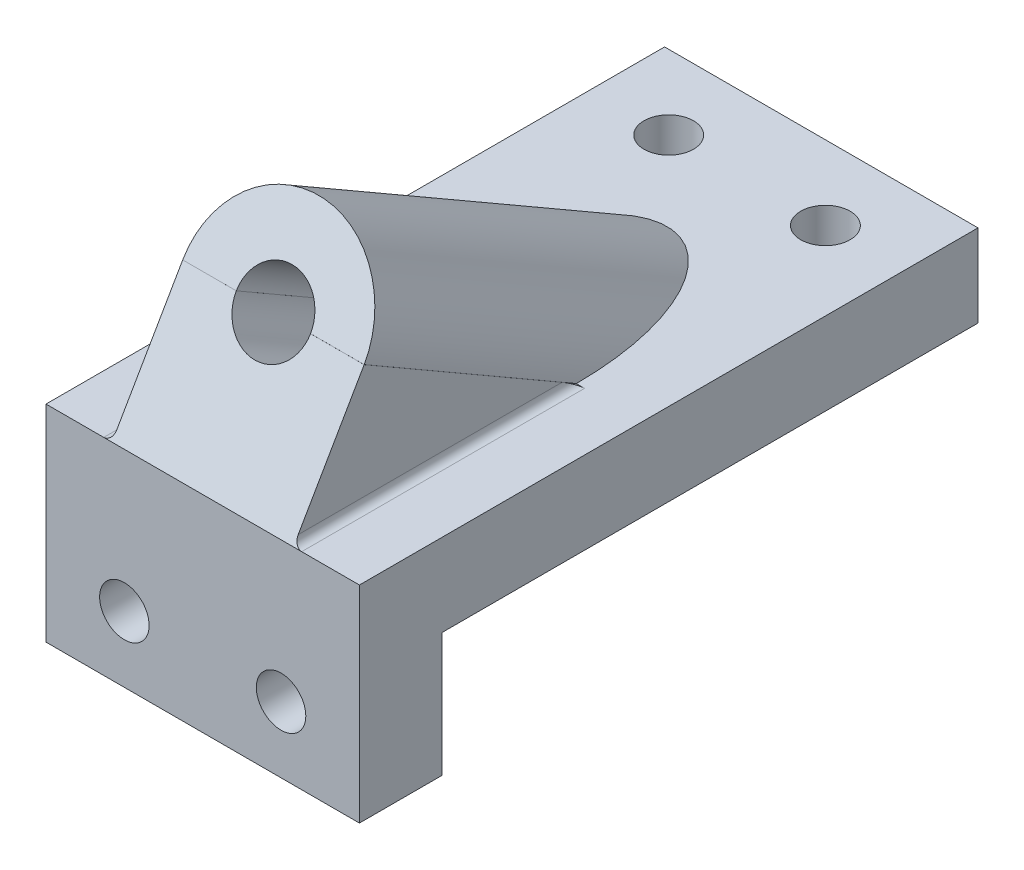
ISO-10303-21;
HEADER;
FILE_DESCRIPTION(('STEP AP214'),'2;1');
FILE_NAME('part.step','',(''),(''),'','','');
FILE_SCHEMA(('AUTOMOTIVE_DESIGN { 1 0 10303 214 1 1 1 1 }'));
ENDSEC;
DATA;
#1=APPLICATION_CONTEXT('core data for automotive mechanical design processes');
#2=APPLICATION_PROTOCOL_DEFINITION('international standard','automotive_design',2000,#1);
#3=PRODUCT_CONTEXT('',#1,'mechanical');
#4=PRODUCT('Part','Part','',(#3));
#5=PRODUCT_RELATED_PRODUCT_CATEGORY('part','',(#4));
#6=PRODUCT_DEFINITION_FORMATION('','',#4);
#7=PRODUCT_DEFINITION_CONTEXT('part definition',#1,'design');
#8=PRODUCT_DEFINITION('design','',#6,#7);
#9=PRODUCT_DEFINITION_SHAPE('','',#8);
#10=(LENGTH_UNIT() NAMED_UNIT(*) SI_UNIT(.MILLI.,.METRE.));
#11=(NAMED_UNIT(*) PLANE_ANGLE_UNIT() SI_UNIT($,.RADIAN.));
#12=(NAMED_UNIT(*) SI_UNIT($,.STERADIAN.) SOLID_ANGLE_UNIT());
#13=UNCERTAINTY_MEASURE_WITH_UNIT(LENGTH_MEASURE(1.E-05),#10,'distance_accuracy_value','');
#14=(GEOMETRIC_REPRESENTATION_CONTEXT(3) GLOBAL_UNCERTAINTY_ASSIGNED_CONTEXT((#13)) GLOBAL_UNIT_ASSIGNED_CONTEXT((#10,
#11,#12)) REPRESENTATION_CONTEXT('',''));
#15=CARTESIAN_POINT('',(0.,0.,0.));
#16=DIRECTION('',(0.,0.,1.));
#17=DIRECTION('',(1.,0.,0.));
#18=AXIS2_PLACEMENT_3D('',#15,#16,#17);
#19=CARTESIAN_POINT('',(-60.,14.0706033738834,-46.2832955152044));
#20=DIRECTION('',(0.000208288153182794,-0.866025384998633,0.499999989154015));
#21=DIRECTION('',(0.,-0.500000000000004,-0.866025403784436));
#22=AXIS2_PLACEMENT_3D('',#19,#20,#21);
#23=PLANE('',#22);
#24=DIRECTION('',(0.,0.500000000000004,0.866025403784436));
#25=VECTOR('',#24,1.);
#26=CARTESIAN_POINT('',(-29.0000001952278,18.5761952417604,-38.4922953475685));
#27=LINE('',#26,#25);
#28=CARTESIAN_POINT('',(-29.0000001952278,18.5761952417604,-38.4922953475685));
#29=VERTEX_POINT('',#28);
#30=CARTESIAN_POINT('',(-29.0000001952278,63.0761952417607,38.5839655892464));
#31=VERTEX_POINT('',#30);
#32=EDGE_CURVE('E61',#29,#31,#27,.T.);
#33=ORIENTED_EDGE('',*,*,#32,.F.);
#34=DIRECTION('',(-0.999999978308022,-0.000180382831963644,0.000104144076591398));
#35=VECTOR('',#34,1.);
#36=CARTESIAN_POINT('',(-60.,18.5706033738834,-38.4890668811444));
#37=LINE('',#36,#35);
#38=CARTESIAN_POINT('',(-46.9999998047722,18.572948350785,-38.4904207541898));
#39=VERTEX_POINT('',#38);
#40=EDGE_CURVE('E12',#29,#39,#37,.T.);
#41=ORIENTED_EDGE('',*,*,#40,.T.);
#42=DIRECTION('',(0.,0.500000000000004,0.866025403784436));
#43=VECTOR('',#42,1.);
#44=CARTESIAN_POINT('',(-46.9999998047722,18.572948350785,-38.4904207541898));
#45=LINE('',#44,#43);
#46=CARTESIAN_POINT('',(-46.9999998047722,63.0729483507854,38.585840182625));
#47=VERTEX_POINT('',#46);
#48=EDGE_CURVE('E100',#47,#39,#45,.F.);
#49=ORIENTED_EDGE('',*,*,#48,.F.);
#50=DIRECTION('',(0.999999978308022,0.000180382831963653,-0.000104144076591382));
#51=VECTOR('',#50,1.);
#52=CARTESIAN_POINT('',(-60.,63.0706033738838,38.5871940556704));
#53=LINE('',#52,#51);
#54=CARTESIAN_POINT('',(-60.,63.0706033738838,38.5871940556704));
#55=VERTEX_POINT('',#54);
#56=EDGE_CURVE('E92',#55,#47,#53,.T.);
#57=ORIENTED_EDGE('',*,*,#56,.F.);
#58=DIRECTION('',(0.,0.500000000000004,0.866025403784436));
#59=VECTOR('',#58,1.);
#60=CARTESIAN_POINT('',(-60.,14.0706033738834,-46.2832955152044));
#61=LINE('',#60,#59);
#62=CARTESIAN_POINT('',(-60.,14.0706033738834,-46.2832955152044));
#63=VERTEX_POINT('',#62);
#64=EDGE_CURVE('E54',#63,#55,#61,.T.);
#65=ORIENTED_EDGE('',*,*,#64,.F.);
#66=DIRECTION('',(0.999999978308022,0.000180382831963653,-0.000104144076591382));
#67=VECTOR('',#66,1.);
#68=CARTESIAN_POINT('',(-60.,14.0706033738834,-46.2832955152044));
#69=LINE('',#68,#67);
#70=CARTESIAN_POINT('',(-16.,14.0785402186619,-46.2878778546738));
#71=VERTEX_POINT('',#70);
#72=EDGE_CURVE('E96',#63,#71,#69,.T.);
#73=ORIENTED_EDGE('',*,*,#72,.T.);
#74=DIRECTION('',(0.,0.500000000000004,0.866025403784436));
#75=VECTOR('',#74,1.);
#76=CARTESIAN_POINT('',(-16.,14.0785402186619,-46.2878778546738));
#77=LINE('',#76,#75);
#78=CARTESIAN_POINT('',(-16.,63.0785402186623,38.582611716201));
#79=VERTEX_POINT('',#78);
#80=EDGE_CURVE('E87',#71,#79,#77,.T.);
#81=ORIENTED_EDGE('',*,*,#80,.T.);
#82=EDGE_CURVE('E94',#31,#79,#53,.T.);
#83=ORIENTED_EDGE('',*,*,#82,.F.);
#84=EDGE_LOOP('',(#33,#41,#49,#57,#65,#73,#81,#83));
#85=FACE_BOUND('',#84,.T.);
#86=ADVANCED_FACE('F47',(#85),#23,.T.);
#87=CARTESIAN_POINT('',(-38.,14.0745717962727,-46.2855866849391));
#88=DIRECTION('',(0.,0.500000000000004,0.866025403784436));
#89=DIRECTION('',(0.,-0.866025403784436,0.500000000000004));
#90=AXIS2_PLACEMENT_3D('',#87,#88,#89);
#91=CYLINDRICAL_SURFACE('',#90,22.0000004772235);
#92=CARTESIAN_POINT('',(-38.,63.0745717962731,38.5849028859357));
#93=DIRECTION('',(0.,-0.500000000000004,-0.866025403784436));
#94=DIRECTION('',(0.,0.866025403784436,-0.500000000000004));
#95=AXIS2_PLACEMENT_3D('',#92,#93,#94);
#96=CIRCLE('',#95,22.0000004772235);
#97=EDGE_CURVE('E84',#55,#79,#96,.T.);
#98=ORIENTED_EDGE('',*,*,#97,.T.);
#99=ORIENTED_EDGE('',*,*,#80,.F.);
#100=CARTESIAN_POINT('',(-38.,14.0745717962727,-46.2855866849391));
#101=DIRECTION('',(0.,-0.500000000000004,-0.866025403784436));
#102=DIRECTION('',(0.,0.866025403784436,-0.500000000000004));
#103=AXIS2_PLACEMENT_3D('',#100,#101,#102);
#104=CIRCLE('',#103,22.0000004772235);
#105=EDGE_CURVE('E85',#63,#71,#104,.T.);
#106=ORIENTED_EDGE('',*,*,#105,.F.);
#107=ORIENTED_EDGE('',*,*,#64,.T.);
#108=EDGE_LOOP('',(#98,#99,#106,#107));
#109=FACE_BOUND('',#108,.T.);
#110=ADVANCED_FACE('F82',(#109),#91,.T.);
#111=CARTESIAN_POINT('',(-38.,14.0745717962727,-46.2855866849391));
#112=DIRECTION('',(0.,-0.500000000000004,-0.866025403784436));
#113=DIRECTION('',(0.,0.866025403784436,-0.500000000000004));
#114=AXIS2_PLACEMENT_3D('',#111,#112,#113);
#115=PLANE('',#114);
#116=ORIENTED_EDGE('',*,*,#72,.F.);
#117=ORIENTED_EDGE('',*,*,#105,.T.);
#118=EDGE_LOOP('',(#116,#117));
#119=FACE_BOUND('',#118,.T.);
#120=ADVANCED_FACE('F127',(#119),#115,.T.);
#121=CARTESIAN_POINT('',(-38.,63.0745717962731,38.5849028859357));
#122=DIRECTION('',(0.,-0.500000000000004,-0.866025403784436));
#123=DIRECTION('',(0.,0.866025403784436,-0.500000000000004));
#124=AXIS2_PLACEMENT_3D('',#121,#122,#123);
#125=PLANE('',#124);
#126=ORIENTED_EDGE('',*,*,#56,.T.);
#127=CARTESIAN_POINT('',(-38.,63.0745717962731,38.5849028859357));
#128=DIRECTION('',(0.,0.500000000000004,0.866025403784436));
#129=DIRECTION('',(0.,-0.866025403784436,0.500000000000004));
#130=AXIS2_PLACEMENT_3D('',#127,#128,#129);
#131=CIRCLE('',#130,9.);
#132=EDGE_CURVE('E109',#31,#47,#131,.T.);
#133=ORIENTED_EDGE('',*,*,#132,.F.);
#134=ORIENTED_EDGE('',*,*,#82,.T.);
#135=ORIENTED_EDGE('',*,*,#97,.F.);
#136=EDGE_LOOP('',(#126,#133,#134,#135));
#137=FACE_BOUND('',#136,.T.);
#138=ADVANCED_FACE('F91',(#137),#125,.F.);
#139=CARTESIAN_POINT('',(-38.,18.5745717962727,-38.4913580508791));
#140=DIRECTION('',(0.,0.500000000000004,0.866025403784436));
#141=DIRECTION('',(0.,-0.866025403784436,0.500000000000004));
#142=AXIS2_PLACEMENT_3D('',#139,#140,#141);
#143=CYLINDRICAL_SURFACE('',#142,9.);
#144=ORIENTED_EDGE('',*,*,#32,.T.);
#145=ORIENTED_EDGE('',*,*,#132,.T.);
#146=ORIENTED_EDGE('',*,*,#48,.T.);
#147=CARTESIAN_POINT('',(-38.,18.5745717962727,-38.4913580508791));
#148=DIRECTION('',(0.,0.500000000000004,0.866025403784436));
#149=DIRECTION('',(0.,-0.866025403784436,0.500000000000004));
#150=AXIS2_PLACEMENT_3D('',#147,#148,#149);
#151=CIRCLE('',#150,9.);
#152=EDGE_CURVE('E108',#29,#39,#151,.T.);
#153=ORIENTED_EDGE('',*,*,#152,.F.);
#154=EDGE_LOOP('',(#144,#145,#146,#153));
#155=FACE_BOUND('',#154,.T.);
#156=ADVANCED_FACE('F119',(#155),#143,.F.);
#157=CARTESIAN_POINT('',(-38.,18.5745717962727,-38.4913580508791));
#158=DIRECTION('',(0.,0.500000000000004,0.866025403784436));
#159=DIRECTION('',(0.,-0.866025403784436,0.500000000000004));
#160=AXIS2_PLACEMENT_3D('',#157,#158,#159);
#161=PLANE('',#160);
#162=ORIENTED_EDGE('',*,*,#152,.T.);
#163=ORIENTED_EDGE('',*,*,#40,.F.);
#164=EDGE_LOOP('',(#162,#163));
#165=FACE_BOUND('',#164,.T.);
#166=ADVANCED_FACE('F115',(#165),#161,.T.);
#167=CLOSED_SHELL('',(#86,#110,#120,#138,#156,#166));
#168=MANIFOLD_SOLID_BREP('B2',#167);
#169=CARTESIAN_POINT('',(-60.,63.0706033738838,38.5871940556704));
#170=DIRECTION('',(0.,0.866025403784437,-0.500000000000004));
#171=DIRECTION('',(0.,0.500000000000004,0.866025403784437));
#172=AXIS2_PLACEMENT_3D('',#169,#170,#171);
#173=PLANE('',#172);
#174=DIRECTION('',(0.,0.500000000000004,0.866025403784436));
#175=VECTOR('',#174,1.);
#176=CARTESIAN_POINT('',(-46.9999988334535,18.5706033738834,-38.4890668811444));
#177=LINE('',#176,#175);
#178=CARTESIAN_POINT('',(-46.9999988334535,33.3715596330275,-12.8530586397025));
#179=VERTEX_POINT('',#178);
#180=CARTESIAN_POINT('',(-46.9999988334535,63.0706033738838,38.5871940556704));
#181=VERTEX_POINT('',#180);
#182=EDGE_CURVE('E278',#179,#181,#177,.T.);
#183=ORIENTED_EDGE('',*,*,#182,.F.);
#184=DIRECTION('',(1.,0.,0.));
#185=VECTOR('',#184,1.);
#186=CARTESIAN_POINT('',(-60.,33.3715596330275,-12.8530586397025));
#187=LINE('',#186,#185);
#188=CARTESIAN_POINT('',(-62.,33.3715596330275,-12.8530586397025));
#189=VERTEX_POINT('',#188);
#190=EDGE_CURVE('E308',#189,#179,#187,.T.);
#191=ORIENTED_EDGE('',*,*,#190,.F.);
#192=CARTESIAN_POINT('',(-62.,35.3715596330275,-9.38895702456481));
#193=DIRECTION('',(0.,0.866025403784437,-0.500000000000004));
#194=DIRECTION('',(0.,0.500000000000004,0.866025403784437));
#195=AXIS2_PLACEMENT_3D('',#192,#193,#194);
#196=ELLIPSE('',#195,3.99999999999997,2.);
#197=CARTESIAN_POINT('',(-60.,35.3715596330275,-9.38895702456482));
#198=VERTEX_POINT('',#197);
#199=EDGE_CURVE('E399',#189,#198,#196,.F.);
#200=ORIENTED_EDGE('',*,*,#199,.T.);
#201=DIRECTION('',(0.,0.500000000000004,0.866025403784437));
#202=VECTOR('',#201,1.);
#203=CARTESIAN_POINT('',(-60.,63.0706033738838,38.5871940556704));
#204=LINE('',#203,#202);
#205=CARTESIAN_POINT('',(-60.,63.0706033738838,38.5871940556704));
#206=VERTEX_POINT('',#205);
#207=EDGE_CURVE('E304',#198,#206,#204,.T.);
#208=ORIENTED_EDGE('',*,*,#207,.T.);
#209=DIRECTION('',(1.,0.,0.));
#210=VECTOR('',#209,1.);
#211=CARTESIAN_POINT('',(-60.,63.0706033738838,38.5871940556704));
#212=LINE('',#211,#210);
#213=EDGE_CURVE('E296',#206,#181,#212,.T.);
#214=ORIENTED_EDGE('',*,*,#213,.T.);
#215=EDGE_LOOP('',(#183,#191,#200,#208,#214));
#216=FACE_BOUND('',#215,.T.);
#217=ADVANCED_FACE('F182',(#216),#173,.T.);
#218=CARTESIAN_POINT('',(-76.,16.3532110091743,55.7339449541284));
#219=DIRECTION('',(0.,0.,1.));
#220=DIRECTION('',(1.,0.,0.));
#221=AXIS2_PLACEMENT_3D('',#218,#219,#220);
#222=PLANE('',#221);
#223=CARTESIAN_POINT('',(-57.,-0.628440366972479,55.7339449541284));
#224=DIRECTION('',(0.,0.,1.));
#225=DIRECTION('',(1.,0.,0.));
#226=AXIS2_PLACEMENT_3D('',#223,#224,#225);
#227=CIRCLE('',#226,6.);
#228=CARTESIAN_POINT('',(-51.,-0.628440366972479,55.7339449541284));
#229=VERTEX_POINT('',#228);
#230=EDGE_CURVE('E313',#229,#229,#227,.T.);
#231=ORIENTED_EDGE('',*,*,#230,.F.);
#232=EDGE_LOOP('',(#231));
#233=FACE_BOUND('',#232,.T.);
#234=CARTESIAN_POINT('',(-19.,-0.628440366972472,55.7339449541284));
#235=DIRECTION('',(0.,0.,1.));
#236=DIRECTION('',(1.,0.,0.));
#237=AXIS2_PLACEMENT_3D('',#234,#235,#236);
#238=CIRCLE('',#237,6.);
#239=CARTESIAN_POINT('',(-13.,-0.628440366972472,55.7339449541284));
#240=VERTEX_POINT('',#239);
#241=EDGE_CURVE('E306',#240,#240,#238,.T.);
#242=ORIENTED_EDGE('',*,*,#241,.F.);
#243=EDGE_LOOP('',(#242));
#244=FACE_BOUND('',#243,.T.);
#245=DIRECTION('',(0.,-1.,0.));
#246=VECTOR('',#245,1.);
#247=CARTESIAN_POINT('',(0.,16.3532110091743,55.7339449541284));
#248=LINE('',#247,#246);
#249=CARTESIAN_POINT('',(0.,33.3715596330275,55.7339449541284));
#250=VERTEX_POINT('',#249);
#251=CARTESIAN_POINT('',(0.,-16.6284403669725,55.7339449541284));
#252=VERTEX_POINT('',#251);
#253=EDGE_CURVE('E331',#250,#252,#248,.T.);
#254=ORIENTED_EDGE('',*,*,#253,.F.);
#255=DIRECTION('',(1.,0.,0.));
#256=VECTOR('',#255,1.);
#257=CARTESIAN_POINT('',(-76.,33.3715596330275,55.7339449541284));
#258=LINE('',#257,#256);
#259=CARTESIAN_POINT('',(-14.,33.3715596330275,55.7339449541284));
#260=VERTEX_POINT('',#259);
#261=EDGE_CURVE('E366',#260,#250,#258,.T.);
#262=ORIENTED_EDGE('',*,*,#261,.F.);
#263=DIRECTION('',(1.,0.,0.));
#264=VECTOR('',#263,1.);
#265=CARTESIAN_POINT('',(-60.,33.3715596330275,55.7339449541284));
#266=LINE('',#265,#264);
#267=CARTESIAN_POINT('',(-62.,33.3715596330275,55.7339449541284));
#268=VERTEX_POINT('',#267);
#269=EDGE_CURVE('E198',#268,#260,#266,.T.);
#270=ORIENTED_EDGE('',*,*,#269,.F.);
#271=CARTESIAN_POINT('',(-76.,33.3715596330275,55.7339449541284));
#272=VERTEX_POINT('',#271);
#273=EDGE_CURVE('E364',#272,#268,#258,.T.);
#274=ORIENTED_EDGE('',*,*,#273,.F.);
#275=DIRECTION('',(0.,-1.,0.));
#276=VECTOR('',#275,1.);
#277=CARTESIAN_POINT('',(-76.,16.3532110091743,55.7339449541284));
#278=LINE('',#277,#276);
#279=CARTESIAN_POINT('',(-76.,-16.6284403669725,55.7339449541284));
#280=VERTEX_POINT('',#279);
#281=EDGE_CURVE('E327',#272,#280,#278,.T.);
#282=ORIENTED_EDGE('',*,*,#281,.T.);
#283=DIRECTION('',(1.,0.,0.));
#284=VECTOR('',#283,1.);
#285=CARTESIAN_POINT('',(-76.,-16.6284403669725,55.7339449541284));
#286=LINE('',#285,#284);
#287=EDGE_CURVE('E346',#280,#252,#286,.T.);
#288=ORIENTED_EDGE('',*,*,#287,.T.);
#289=EDGE_LOOP('',(#254,#262,#270,#274,#282,#288));
#290=FACE_BOUND('',#289,.T.);
#291=ADVANCED_FACE('F418',(#233,#244,#290),#222,.T.);
#292=CARTESIAN_POINT('',(-76.,33.3715596330275,55.7339449541284));
#293=DIRECTION('',(0.,1.,0.));
#294=DIRECTION('',(0.,0.,1.));
#295=AXIS2_PLACEMENT_3D('',#292,#293,#294);
#296=PLANE('',#295);
#297=ORIENTED_EDGE('',*,*,#273,.T.);
#298=DIRECTION('',(0.,0.,-1.));
#299=VECTOR('',#298,1.);
#300=CARTESIAN_POINT('',(-62.,33.3715596330275,-12.8530586397025));
#301=LINE('',#300,#299);
#302=EDGE_CURVE('E391',#268,#189,#301,.T.);
#303=ORIENTED_EDGE('',*,*,#302,.T.);
#304=ORIENTED_EDGE('',*,*,#190,.T.);
#305=CARTESIAN_POINT('',(-38.,33.3715596330275,-12.8622233186413));
#306=DIRECTION('',(0.,1.,0.));
#307=DIRECTION('',(0.,0.,1.));
#308=AXIS2_PLACEMENT_3D('',#305,#306,#307);
#309=ELLIPSE('',#308,17.9999999999999,9.);
#310=CARTESIAN_POINT('',(-29.0000011665465,33.3715596330275,-12.8530586397025));
#311=VERTEX_POINT('',#310);
#312=EDGE_CURVE('E284',#311,#179,#309,.T.);
#313=ORIENTED_EDGE('',*,*,#312,.F.);
#314=CARTESIAN_POINT('',(-14.,33.3715596330275,-12.8530586397025));
#315=VERTEX_POINT('',#314);
#316=EDGE_CURVE('E312',#311,#315,#187,.T.);
#317=ORIENTED_EDGE('',*,*,#316,.T.);
#318=DIRECTION('',(0.,0.,-1.));
#319=VECTOR('',#318,1.);
#320=CARTESIAN_POINT('',(-14.,33.3715596330275,55.7339449541284));
#321=LINE('',#320,#319);
#322=EDGE_CURVE('E388',#315,#260,#321,.F.);
#323=ORIENTED_EDGE('',*,*,#322,.T.);
#324=ORIENTED_EDGE('',*,*,#261,.T.);
#325=DIRECTION('',(0.,0.,1.));
#326=VECTOR('',#325,1.);
#327=CARTESIAN_POINT('',(0.,33.3715596330275,55.7339449541284));
#328=LINE('',#327,#326);
#329=CARTESIAN_POINT('',(0.,33.3715596330275,-94.2660550458716));
#330=VERTEX_POINT('',#329);
#331=EDGE_CURVE('E360',#330,#250,#328,.T.);
#332=ORIENTED_EDGE('',*,*,#331,.F.);
#333=DIRECTION('',(1.,0.,0.));
#334=VECTOR('',#333,1.);
#335=CARTESIAN_POINT('',(-76.,33.3715596330275,-94.2660550458716));
#336=LINE('',#335,#334);
#337=CARTESIAN_POINT('',(-76.,33.3715596330275,-94.2660550458716));
#338=VERTEX_POINT('',#337);
#339=EDGE_CURVE('E367',#338,#330,#336,.T.);
#340=ORIENTED_EDGE('',*,*,#339,.F.);
#341=DIRECTION('',(0.,0.,1.));
#342=VECTOR('',#341,1.);
#343=CARTESIAN_POINT('',(-76.,33.3715596330275,55.7339449541284));
#344=LINE('',#343,#342);
#345=EDGE_CURVE('E343',#338,#272,#344,.T.);
#346=ORIENTED_EDGE('',*,*,#345,.T.);
#347=EDGE_LOOP('',(#297,#303,#304,#313,#317,#323,#324,#332,#340,#346));
#348=FACE_BOUND('',#347,.T.);
#349=CARTESIAN_POINT('',(-57.,33.3715596330275,-76.2660550458716));
#350=DIRECTION('',(0.,1.,0.));
#351=DIRECTION('',(0.,0.,1.));
#352=AXIS2_PLACEMENT_3D('',#349,#350,#351);
#353=CIRCLE('',#352,6.);
#354=CARTESIAN_POINT('',(-57.,33.3715596330275,-70.2660550458716));
#355=VERTEX_POINT('',#354);
#356=EDGE_CURVE('E319',#355,#355,#353,.T.);
#357=ORIENTED_EDGE('',*,*,#356,.F.);
#358=EDGE_LOOP('',(#357));
#359=FACE_BOUND('',#358,.T.);
#360=CARTESIAN_POINT('',(-19.,33.3715596330275,-76.2660550458716));
#361=DIRECTION('',(0.,1.,0.));
#362=DIRECTION('',(0.,0.,1.));
#363=AXIS2_PLACEMENT_3D('',#360,#361,#362);
#364=CIRCLE('',#363,6.00000000000001);
#365=CARTESIAN_POINT('',(-19.,33.3715596330275,-70.2660550458716));
#366=VERTEX_POINT('',#365);
#367=EDGE_CURVE('E323',#366,#366,#364,.T.);
#368=ORIENTED_EDGE('',*,*,#367,.F.);
#369=EDGE_LOOP('',(#368));
#370=FACE_BOUND('',#369,.T.);
#371=ADVANCED_FACE('F414',(#348,#359,#370),#296,.T.);
#372=CARTESIAN_POINT('',(-76.,33.3715596330275,-94.2660550458716));
#373=DIRECTION('',(0.,0.,-1.));
#374=DIRECTION('',(-1.,0.,0.));
#375=AXIS2_PLACEMENT_3D('',#372,#373,#374);
#376=PLANE('',#375);
#377=DIRECTION('',(0.,1.,0.));
#378=VECTOR('',#377,1.);
#379=CARTESIAN_POINT('',(0.,33.3715596330275,-94.2660550458716));
#380=LINE('',#379,#378);
#381=CARTESIAN_POINT('',(0.,13.3715596330275,-94.2660550458716));
#382=VERTEX_POINT('',#381);
#383=EDGE_CURVE('E357',#382,#330,#380,.T.);
#384=ORIENTED_EDGE('',*,*,#383,.F.);
#385=DIRECTION('',(1.,0.,0.));
#386=VECTOR('',#385,1.);
#387=CARTESIAN_POINT('',(-76.,13.3715596330275,-94.2660550458716));
#388=LINE('',#387,#386);
#389=CARTESIAN_POINT('',(-76.,13.3715596330275,-94.2660550458716));
#390=VERTEX_POINT('',#389);
#391=EDGE_CURVE('E369',#390,#382,#388,.T.);
#392=ORIENTED_EDGE('',*,*,#391,.F.);
#393=DIRECTION('',(0.,1.,0.));
#394=VECTOR('',#393,1.);
#395=CARTESIAN_POINT('',(-76.,33.3715596330275,-94.2660550458716));
#396=LINE('',#395,#394);
#397=EDGE_CURVE('E340',#390,#338,#396,.T.);
#398=ORIENTED_EDGE('',*,*,#397,.T.);
#399=ORIENTED_EDGE('',*,*,#339,.T.);
#400=EDGE_LOOP('',(#384,#392,#398,#399));
#401=FACE_BOUND('',#400,.T.);
#402=ADVANCED_FACE('F430',(#401),#376,.T.);
#403=CARTESIAN_POINT('',(-76.,13.3715596330275,-94.2660550458716));
#404=DIRECTION('',(0.,-1.,0.));
#405=DIRECTION('',(0.,0.,-1.));
#406=AXIS2_PLACEMENT_3D('',#403,#404,#405);
#407=PLANE('',#406);
#408=CARTESIAN_POINT('',(-38.,13.3715596330275,-47.5032394700185));
#409=DIRECTION('',(0.,-1.,0.));
#410=DIRECTION('',(0.,0.,1.));
#411=AXIS2_PLACEMENT_3D('',#408,#409,#410);
#412=ELLIPSE('',#411,17.9999999999999,9.);
#413=CARTESIAN_POINT('',(-31.2988892036098,13.3715596330275,-35.4873975778326));
#414=VERTEX_POINT('',#413);
#415=CARTESIAN_POINT('',(-44.7011107963902,13.3715596330275,-35.4873975778326));
#416=VERTEX_POINT('',#415);
#417=EDGE_CURVE('E454',#414,#416,#412,.T.);
#418=ORIENTED_EDGE('',*,*,#417,.F.);
#419=DIRECTION('',(-1.,0.,0.));
#420=VECTOR('',#419,1.);
#421=CARTESIAN_POINT('',(-76.,13.3715596330275,-35.4873975778326));
#422=LINE('',#421,#420);
#423=EDGE_CURVE('E288',#414,#416,#422,.T.);
#424=ORIENTED_EDGE('',*,*,#423,.T.);
#425=EDGE_LOOP('',(#418,#424));
#426=FACE_BOUND('',#425,.T.);
#427=CARTESIAN_POINT('',(-57.,13.3715596330275,-76.2660550458716));
#428=DIRECTION('',(0.,-1.,0.));
#429=DIRECTION('',(0.,0.,-1.));
#430=AXIS2_PLACEMENT_3D('',#427,#428,#429);
#431=CIRCLE('',#430,6.);
#432=CARTESIAN_POINT('',(-57.,13.3715596330275,-82.2660550458716));
#433=VERTEX_POINT('',#432);
#434=EDGE_CURVE('E351',#433,#433,#431,.T.);
#435=ORIENTED_EDGE('',*,*,#434,.F.);
#436=EDGE_LOOP('',(#435));
#437=FACE_BOUND('',#436,.T.);
#438=CARTESIAN_POINT('',(-19.,13.3715596330275,-76.2660550458716));
#439=DIRECTION('',(0.,-1.,0.));
#440=DIRECTION('',(0.,0.,-1.));
#441=AXIS2_PLACEMENT_3D('',#438,#439,#440);
#442=CIRCLE('',#441,6.00000000000001);
#443=CARTESIAN_POINT('',(-19.,13.3715596330275,-82.2660550458716));
#444=VERTEX_POINT('',#443);
#445=EDGE_CURVE('E322',#444,#444,#442,.T.);
#446=ORIENTED_EDGE('',*,*,#445,.F.);
#447=EDGE_LOOP('',(#446));
#448=FACE_BOUND('',#447,.T.);
#449=DIRECTION('',(0.,0.,-1.));
#450=VECTOR('',#449,1.);
#451=CARTESIAN_POINT('',(0.,13.3715596330275,-94.2660550458716));
#452=LINE('',#451,#450);
#453=CARTESIAN_POINT('',(0.,13.3715596330275,35.7339449541284));
#454=VERTEX_POINT('',#453);
#455=EDGE_CURVE('E354',#454,#382,#452,.T.);
#456=ORIENTED_EDGE('',*,*,#455,.F.);
#457=DIRECTION('',(1.,0.,0.));
#458=VECTOR('',#457,1.);
#459=CARTESIAN_POINT('',(-76.,13.3715596330275,35.7339449541284));
#460=LINE('',#459,#458);
#461=CARTESIAN_POINT('',(-76.,13.3715596330275,35.7339449541284));
#462=VERTEX_POINT('',#461);
#463=EDGE_CURVE('E371',#462,#454,#460,.T.);
#464=ORIENTED_EDGE('',*,*,#463,.F.);
#465=DIRECTION('',(0.,0.,-1.));
#466=VECTOR('',#465,1.);
#467=CARTESIAN_POINT('',(-76.,13.3715596330275,-94.2660550458716));
#468=LINE('',#467,#466);
#469=EDGE_CURVE('E337',#462,#390,#468,.T.);
#470=ORIENTED_EDGE('',*,*,#469,.T.);
#471=ORIENTED_EDGE('',*,*,#391,.T.);
#472=EDGE_LOOP('',(#456,#464,#470,#471));
#473=FACE_BOUND('',#472,.T.);
#474=ADVANCED_FACE('F433',(#426,#437,#448,#473),#407,.T.);
#475=CARTESIAN_POINT('',(-76.,-16.6284403669725,35.7339449541284));
#476=DIRECTION('',(0.,0.,-1.));
#477=DIRECTION('',(-1.,0.,0.));
#478=AXIS2_PLACEMENT_3D('',#475,#476,#477);
#479=PLANE('',#478);
#480=CARTESIAN_POINT('',(-57.,-0.628440366972479,35.7339449541284));
#481=DIRECTION('',(0.,0.,-1.));
#482=DIRECTION('',(-1.,0.,0.));
#483=AXIS2_PLACEMENT_3D('',#480,#481,#482);
#484=CIRCLE('',#483,6.);
#485=CARTESIAN_POINT('',(-63.,-0.628440366972479,35.7339449541284));
#486=VERTEX_POINT('',#485);
#487=EDGE_CURVE('E326',#486,#486,#484,.T.);
#488=ORIENTED_EDGE('',*,*,#487,.F.);
#489=EDGE_LOOP('',(#488));
#490=FACE_BOUND('',#489,.T.);
#491=CARTESIAN_POINT('',(-19.,-0.628440366972472,35.7339449541284));
#492=DIRECTION('',(0.,0.,-1.));
#493=DIRECTION('',(-1.,0.,0.));
#494=AXIS2_PLACEMENT_3D('',#491,#492,#493);
#495=CIRCLE('',#494,6.);
#496=CARTESIAN_POINT('',(-25.,-0.628440366972472,35.7339449541284));
#497=VERTEX_POINT('',#496);
#498=EDGE_CURVE('E316',#497,#497,#495,.T.);
#499=ORIENTED_EDGE('',*,*,#498,.F.);
#500=EDGE_LOOP('',(#499));
#501=FACE_BOUND('',#500,.T.);
#502=DIRECTION('',(0.,1.,0.));
#503=VECTOR('',#502,1.);
#504=CARTESIAN_POINT('',(0.,-16.6284403669725,35.7339449541284));
#505=LINE('',#504,#503);
#506=CARTESIAN_POINT('',(0.,-16.6284403669725,35.7339449541284));
#507=VERTEX_POINT('',#506);
#508=EDGE_CURVE('E350',#507,#454,#505,.T.);
#509=ORIENTED_EDGE('',*,*,#508,.F.);
#510=DIRECTION('',(1.,0.,0.));
#511=VECTOR('',#510,1.);
#512=CARTESIAN_POINT('',(-76.,-16.6284403669725,35.7339449541284));
#513=LINE('',#512,#511);
#514=CARTESIAN_POINT('',(-76.,-16.6284403669725,35.7339449541284));
#515=VERTEX_POINT('',#514);
#516=EDGE_CURVE('E373',#515,#507,#513,.T.);
#517=ORIENTED_EDGE('',*,*,#516,.F.);
#518=DIRECTION('',(0.,1.,0.));
#519=VECTOR('',#518,1.);
#520=CARTESIAN_POINT('',(-76.,-16.6284403669725,35.7339449541284));
#521=LINE('',#520,#519);
#522=EDGE_CURVE('E334',#515,#462,#521,.T.);
#523=ORIENTED_EDGE('',*,*,#522,.T.);
#524=ORIENTED_EDGE('',*,*,#463,.T.);
#525=EDGE_LOOP('',(#509,#517,#523,#524));
#526=FACE_BOUND('',#525,.T.);
#527=ADVANCED_FACE('F437',(#490,#501,#526),#479,.T.);
#528=CARTESIAN_POINT('',(-76.,-16.6284403669725,55.7339449541284));
#529=DIRECTION('',(0.,-1.,0.));
#530=DIRECTION('',(0.,0.,-1.));
#531=AXIS2_PLACEMENT_3D('',#528,#529,#530);
#532=PLANE('',#531);
#533=DIRECTION('',(0.,0.,-1.));
#534=VECTOR('',#533,1.);
#535=CARTESIAN_POINT('',(0.,-16.6284403669725,55.7339449541284));
#536=LINE('',#535,#534);
#537=EDGE_CURVE('E347',#252,#507,#536,.T.);
#538=ORIENTED_EDGE('',*,*,#537,.F.);
#539=ORIENTED_EDGE('',*,*,#287,.F.);
#540=DIRECTION('',(0.,0.,-1.));
#541=VECTOR('',#540,1.);
#542=CARTESIAN_POINT('',(-76.,-16.6284403669725,55.7339449541284));
#543=LINE('',#542,#541);
#544=EDGE_CURVE('E330',#280,#515,#543,.T.);
#545=ORIENTED_EDGE('',*,*,#544,.T.);
#546=ORIENTED_EDGE('',*,*,#516,.T.);
#547=EDGE_LOOP('',(#538,#539,#545,#546));
#548=FACE_BOUND('',#547,.T.);
#549=ADVANCED_FACE('F439',(#548),#532,.T.);
#550=CARTESIAN_POINT('',(-76.,0.,0.));
#551=DIRECTION('',(1.,0.,0.));
#552=DIRECTION('',(0.,0.,-1.));
#553=AXIS2_PLACEMENT_3D('',#550,#551,#552);
#554=PLANE('',#553);
#555=ORIENTED_EDGE('',*,*,#281,.F.);
#556=ORIENTED_EDGE('',*,*,#345,.F.);
#557=ORIENTED_EDGE('',*,*,#397,.F.);
#558=ORIENTED_EDGE('',*,*,#469,.F.);
#559=ORIENTED_EDGE('',*,*,#522,.F.);
#560=ORIENTED_EDGE('',*,*,#544,.F.);
#561=EDGE_LOOP('',(#555,#556,#557,#558,#559,#560));
#562=FACE_BOUND('',#561,.T.);
#563=ADVANCED_FACE('F427',(#562),#554,.F.);
#564=CARTESIAN_POINT('',(0.,0.,0.));
#565=DIRECTION('',(1.,0.,0.));
#566=DIRECTION('',(0.,0.,-1.));
#567=AXIS2_PLACEMENT_3D('',#564,#565,#566);
#568=PLANE('',#567);
#569=ORIENTED_EDGE('',*,*,#253,.T.);
#570=ORIENTED_EDGE('',*,*,#537,.T.);
#571=ORIENTED_EDGE('',*,*,#508,.T.);
#572=ORIENTED_EDGE('',*,*,#455,.T.);
#573=ORIENTED_EDGE('',*,*,#383,.T.);
#574=ORIENTED_EDGE('',*,*,#331,.T.);
#575=EDGE_LOOP('',(#569,#570,#571,#572,#573,#574));
#576=FACE_BOUND('',#575,.T.);
#577=ADVANCED_FACE('F421',(#576),#568,.T.);
#578=CARTESIAN_POINT('',(-19.,-42.6284403669725,-76.2660550458716));
#579=DIRECTION('',(0.,1.,0.));
#580=DIRECTION('',(0.,0.,1.));
#581=AXIS2_PLACEMENT_3D('',#578,#579,#580);
#582=CYLINDRICAL_SURFACE('',#581,6.00000000000001);
#583=ORIENTED_EDGE('',*,*,#445,.T.);
#584=EDGE_LOOP('',(#583));
#585=FACE_BOUND('',#584,.T.);
#586=ORIENTED_EDGE('',*,*,#367,.T.);
#587=EDGE_LOOP('',(#586));
#588=FACE_BOUND('',#587,.T.);
#589=ADVANCED_FACE('F473',(#585,#588),#582,.F.);
#590=CARTESIAN_POINT('',(-57.,-42.6284403669725,-76.2660550458716));
#591=DIRECTION('',(0.,1.,0.));
#592=DIRECTION('',(0.,0.,1.));
#593=AXIS2_PLACEMENT_3D('',#590,#591,#592);
#594=CYLINDRICAL_SURFACE('',#593,6.);
#595=ORIENTED_EDGE('',*,*,#434,.T.);
#596=EDGE_LOOP('',(#595));
#597=FACE_BOUND('',#596,.T.);
#598=ORIENTED_EDGE('',*,*,#356,.T.);
#599=EDGE_LOOP('',(#598));
#600=FACE_BOUND('',#599,.T.);
#601=ADVANCED_FACE('F476',(#597,#600),#594,.F.);
#602=CARTESIAN_POINT('',(-19.,-0.628440366972472,-20.2660550458716));
#603=DIRECTION('',(0.,0.,1.));
#604=DIRECTION('',(1.,0.,0.));
#605=AXIS2_PLACEMENT_3D('',#602,#603,#604);
#606=CYLINDRICAL_SURFACE('',#605,6.);
#607=ORIENTED_EDGE('',*,*,#498,.T.);
#608=EDGE_LOOP('',(#607));
#609=FACE_BOUND('',#608,.T.);
#610=ORIENTED_EDGE('',*,*,#241,.T.);
#611=EDGE_LOOP('',(#610));
#612=FACE_BOUND('',#611,.T.);
#613=ADVANCED_FACE('F506',(#609,#612),#606,.F.);
#614=CARTESIAN_POINT('',(-57.,-0.628440366972479,-20.2660550458716));
#615=DIRECTION('',(0.,0.,1.));
#616=DIRECTION('',(1.,0.,0.));
#617=AXIS2_PLACEMENT_3D('',#614,#615,#616);
#618=CYLINDRICAL_SURFACE('',#617,6.);
#619=ORIENTED_EDGE('',*,*,#487,.T.);
#620=EDGE_LOOP('',(#619));
#621=FACE_BOUND('',#620,.T.);
#622=ORIENTED_EDGE('',*,*,#230,.T.);
#623=EDGE_LOOP('',(#622));
#624=FACE_BOUND('',#623,.T.);
#625=ADVANCED_FACE('F502',(#621,#624),#618,.F.);
#626=CARTESIAN_POINT('',(-60.,33.3715596330275,55.7339449541284));
#627=DIRECTION('',(0.,0.500000000000004,0.866025403784436));
#628=DIRECTION('',(0.,-0.866025403784436,0.500000000000004));
#629=AXIS2_PLACEMENT_3D('',#626,#627,#628);
#630=PLANE('',#629);
#631=CARTESIAN_POINT('',(-38.,63.0745717962731,38.5849028859357));
#632=DIRECTION('',(0.,0.500000000000004,0.866025403784436));
#633=DIRECTION('',(0.,-0.866025403784436,0.500000000000004));
#634=AXIS2_PLACEMENT_3D('',#631,#632,#633);
#635=CIRCLE('',#634,9.);
#636=CARTESIAN_POINT('',(-29.,63.0706033738838,38.5871940556704));
#637=VERTEX_POINT('',#636);
#638=EDGE_CURVE('E281',#181,#637,#635,.T.);
#639=ORIENTED_EDGE('',*,*,#638,.F.);
#640=ORIENTED_EDGE('',*,*,#213,.F.);
#641=DIRECTION('',(0.,-0.866025403784436,0.500000000000004));
#642=VECTOR('',#641,1.);
#643=CARTESIAN_POINT('',(-60.,33.3715596330275,55.7339449541284));
#644=LINE('',#643,#642);
#645=CARTESIAN_POINT('',(-60.,35.3715596330275,54.5792444157492));
#646=VERTEX_POINT('',#645);
#647=EDGE_CURVE('E442',#206,#646,#644,.T.);
#648=ORIENTED_EDGE('',*,*,#647,.T.);
#649=CARTESIAN_POINT('',(-62.,35.3715596330275,54.5792444157492));
#650=DIRECTION('',(0.,0.500000000000004,0.866025403784436));
#651=DIRECTION('',(0.,-0.866025403784436,0.500000000000004));
#652=AXIS2_PLACEMENT_3D('',#649,#650,#651);
#653=ELLIPSE('',#652,2.30940107675851,2.);
#654=EDGE_CURVE('E401',#646,#268,#653,.F.);
#655=ORIENTED_EDGE('',*,*,#654,.T.);
#656=ORIENTED_EDGE('',*,*,#269,.T.);
#657=CARTESIAN_POINT('',(-14.,35.3715596330275,54.5792444157492));
#658=DIRECTION('',(0.,0.500000000000004,0.866025403784436));
#659=DIRECTION('',(0.,0.866025403784436,-0.500000000000004));
#660=AXIS2_PLACEMENT_3D('',#657,#658,#659);
#661=ELLIPSE('',#660,2.30940107675851,2.);
#662=CARTESIAN_POINT('',(-16.,35.3715596330275,54.5792444157492));
#663=VERTEX_POINT('',#662);
#664=EDGE_CURVE('E45',#260,#663,#661,.F.);
#665=ORIENTED_EDGE('',*,*,#664,.T.);
#666=DIRECTION('',(0.,-0.866025403784436,0.500000000000004));
#667=VECTOR('',#666,1.);
#668=CARTESIAN_POINT('',(-16.,33.3715596330275,55.7339449541284));
#669=LINE('',#668,#667);
#670=CARTESIAN_POINT('',(-16.,63.0706033738838,38.5871940556704));
#671=VERTEX_POINT('',#670);
#672=EDGE_CURVE('E449',#671,#663,#669,.T.);
#673=ORIENTED_EDGE('',*,*,#672,.F.);
#674=EDGE_CURVE('E300',#637,#671,#212,.T.);
#675=ORIENTED_EDGE('',*,*,#674,.F.);
#676=EDGE_LOOP('',(#639,#640,#648,#655,#656,#665,#673,#675));
#677=FACE_BOUND('',#676,.T.);
#678=ADVANCED_FACE('F294',(#677),#630,.T.);
#679=DIRECTION('',(0.,0.500000000000004,0.866025403784436));
#680=VECTOR('',#679,1.);
#681=CARTESIAN_POINT('',(-29.0000011665465,18.5706033738834,-38.4890668811444));
#682=LINE('',#681,#680);
#683=EDGE_CURVE('E289',#637,#311,#682,.F.);
#684=ORIENTED_EDGE('',*,*,#683,.F.);
#685=ORIENTED_EDGE('',*,*,#674,.T.);
#686=DIRECTION('',(0.,0.500000000000004,0.866025403784437));
#687=VECTOR('',#686,1.);
#688=CARTESIAN_POINT('',(-16.,63.0706033738838,38.5871940556704));
#689=LINE('',#688,#687);
#690=CARTESIAN_POINT('',(-16.,35.3715596330275,-9.38895702456482));
#691=VERTEX_POINT('',#690);
#692=EDGE_CURVE('E409',#691,#671,#689,.T.);
#693=ORIENTED_EDGE('',*,*,#692,.F.);
#694=CARTESIAN_POINT('',(-14.,35.3715596330275,-9.38895702456481));
#695=DIRECTION('',(0.,0.866025403784437,-0.500000000000004));
#696=DIRECTION('',(0.,-0.500000000000004,-0.866025403784437));
#697=AXIS2_PLACEMENT_3D('',#694,#695,#696);
#698=ELLIPSE('',#697,3.99999999999997,2.);
#699=EDGE_CURVE('E191',#691,#315,#698,.F.);
#700=ORIENTED_EDGE('',*,*,#699,.T.);
#701=ORIENTED_EDGE('',*,*,#316,.F.);
#702=EDGE_LOOP('',(#684,#685,#693,#700,#701));
#703=FACE_BOUND('',#702,.T.);
#704=ADVANCED_FACE('F408',(#703),#173,.T.);
#705=CARTESIAN_POINT('',(-60.,0.,0.));
#706=DIRECTION('',(-1.,0.,0.));
#707=DIRECTION('',(0.,0.,1.));
#708=AXIS2_PLACEMENT_3D('',#705,#706,#707);
#709=PLANE('',#708);
#710=ORIENTED_EDGE('',*,*,#207,.F.);
#711=DIRECTION('',(0.,0.,-1.));
#712=VECTOR('',#711,1.);
#713=CARTESIAN_POINT('',(-60.,35.3715596330275,55.7339449541284));
#714=LINE('',#713,#712);
#715=EDGE_CURVE('E394',#198,#646,#714,.F.);
#716=ORIENTED_EDGE('',*,*,#715,.T.);
#717=ORIENTED_EDGE('',*,*,#647,.F.);
#718=EDGE_LOOP('',(#710,#716,#717));
#719=FACE_BOUND('',#718,.T.);
#720=ADVANCED_FACE('F448',(#719),#709,.T.);
#721=CARTESIAN_POINT('',(-16.,0.,0.));
#722=DIRECTION('',(-1.,0.,0.));
#723=DIRECTION('',(0.,0.,1.));
#724=AXIS2_PLACEMENT_3D('',#721,#722,#723);
#725=PLANE('',#724);
#726=ORIENTED_EDGE('',*,*,#672,.T.);
#727=DIRECTION('',(0.,0.,-1.));
#728=VECTOR('',#727,1.);
#729=CARTESIAN_POINT('',(-16.,35.3715596330275,0.));
#730=LINE('',#729,#728);
#731=EDGE_CURVE('E396',#663,#691,#730,.T.);
#732=ORIENTED_EDGE('',*,*,#731,.T.);
#733=ORIENTED_EDGE('',*,*,#692,.T.);
#734=EDGE_LOOP('',(#726,#732,#733));
#735=FACE_BOUND('',#734,.T.);
#736=ADVANCED_FACE('F500',(#735),#725,.F.);
#737=CARTESIAN_POINT('',(-38.,18.5745717962727,-38.4913580508791));
#738=DIRECTION('',(0.,0.500000000000004,0.866025403784436));
#739=DIRECTION('',(0.,-0.866025403784436,0.500000000000004));
#740=AXIS2_PLACEMENT_3D('',#737,#738,#739);
#741=CYLINDRICAL_SURFACE('',#740,9.);
#742=ORIENTED_EDGE('',*,*,#417,.T.);
#743=CARTESIAN_POINT('',(-38.,18.5745717962727,-38.4913580508791));
#744=DIRECTION('',(0.,0.500000000000004,0.866025403784436));
#745=DIRECTION('',(0.,-0.866025403784436,0.500000000000004));
#746=AXIS2_PLACEMENT_3D('',#743,#744,#745);
#747=CIRCLE('',#746,9.);
#748=EDGE_CURVE('E301',#414,#416,#747,.T.);
#749=ORIENTED_EDGE('',*,*,#748,.F.);
#750=EDGE_LOOP('',(#742,#749));
#751=FACE_BOUND('',#750,.T.);
#752=ORIENTED_EDGE('',*,*,#182,.T.);
#753=ORIENTED_EDGE('',*,*,#638,.T.);
#754=ORIENTED_EDGE('',*,*,#683,.T.);
#755=ORIENTED_EDGE('',*,*,#312,.T.);
#756=EDGE_LOOP('',(#752,#753,#754,#755));
#757=FACE_BOUND('',#756,.T.);
#758=ADVANCED_FACE('F280',(#751,#757),#741,.F.);
#759=CARTESIAN_POINT('',(-38.,18.5745717962727,-38.4913580508791));
#760=DIRECTION('',(0.,0.500000000000004,0.866025403784436));
#761=DIRECTION('',(0.,-0.866025403784436,0.500000000000004));
#762=AXIS2_PLACEMENT_3D('',#759,#760,#761);
#763=PLANE('',#762);
#764=ORIENTED_EDGE('',*,*,#748,.T.);
#765=ORIENTED_EDGE('',*,*,#423,.F.);
#766=EDGE_LOOP('',(#764,#765));
#767=FACE_BOUND('',#766,.T.);
#768=ADVANCED_FACE('F464',(#767),#763,.T.);
#769=CARTESIAN_POINT('',(-62.,35.3715596330275,55.7339449541284));
#770=DIRECTION('',(0.,0.,1.));
#771=DIRECTION('',(1.,0.,0.));
#772=AXIS2_PLACEMENT_3D('',#769,#770,#771);
#773=CYLINDRICAL_SURFACE('',#772,2.);
#774=ORIENTED_EDGE('',*,*,#654,.F.);
#775=ORIENTED_EDGE('',*,*,#715,.F.);
#776=ORIENTED_EDGE('',*,*,#199,.F.);
#777=ORIENTED_EDGE('',*,*,#302,.F.);
#778=EDGE_LOOP('',(#774,#775,#776,#777));
#779=FACE_BOUND('',#778,.T.);
#780=ADVANCED_FACE('F446',(#779),#773,.F.);
#781=CARTESIAN_POINT('',(-14.,35.3715596330275,0.));
#782=DIRECTION('',(0.,0.,-1.));
#783=DIRECTION('',(-1.,0.,0.));
#784=AXIS2_PLACEMENT_3D('',#781,#782,#783);
#785=CYLINDRICAL_SURFACE('',#784,2.);
#786=ORIENTED_EDGE('',*,*,#664,.F.);
#787=ORIENTED_EDGE('',*,*,#322,.F.);
#788=ORIENTED_EDGE('',*,*,#699,.F.);
#789=ORIENTED_EDGE('',*,*,#731,.F.);
#790=EDGE_LOOP('',(#786,#787,#788,#789));
#791=FACE_BOUND('',#790,.T.);
#792=ADVANCED_FACE('F184',(#791),#785,.F.);
#793=CLOSED_SHELL('',(#217,#291,#371,#402,#474,#527,#549,#563,#577,#589,#601,#613,#625,#678,
#704,#720,#736,#758,#768,#780,#792));
#794=MANIFOLD_SOLID_BREP('B6',#793);
#795=ADVANCED_BREP_SHAPE_REPRESENTATION('',(#18,#168,#794),#14);
#796=SHAPE_DEFINITION_REPRESENTATION(#9,#795);
ENDSEC;
END-ISO-10303-21;
